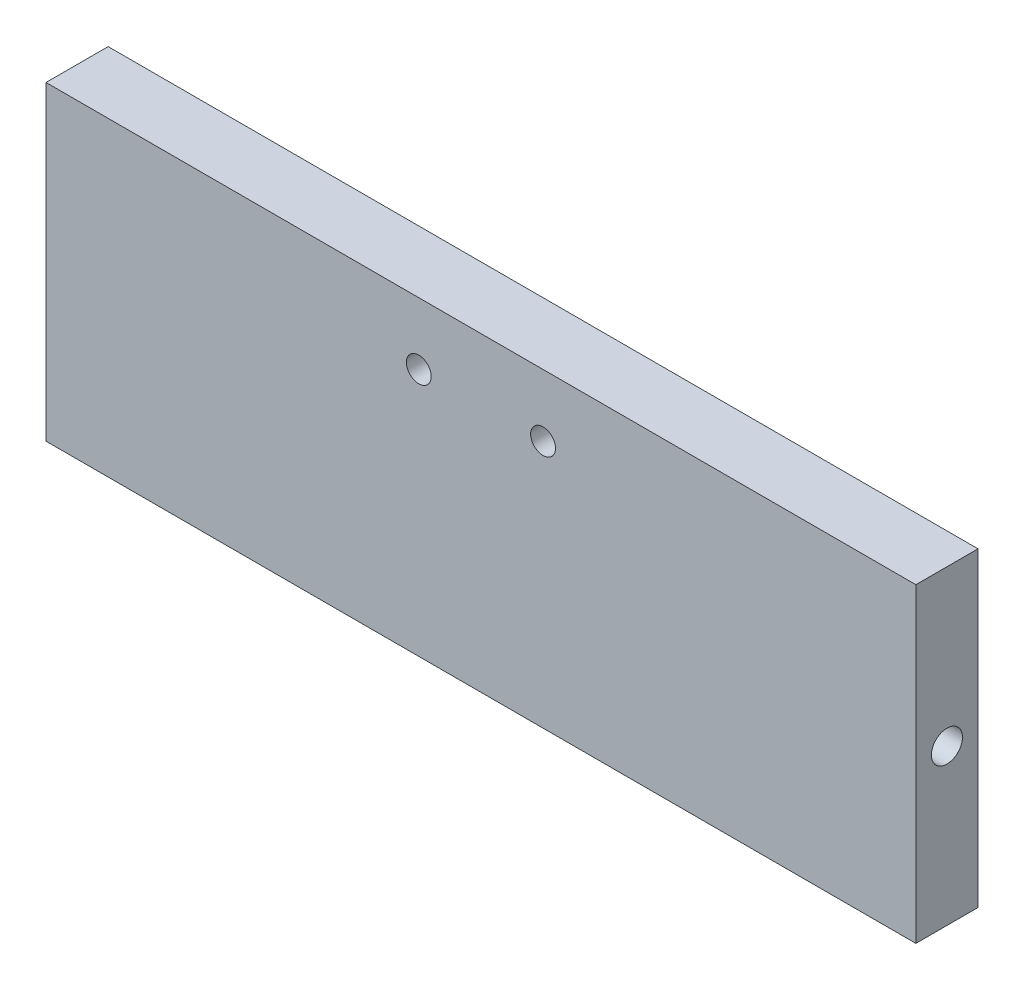
ISO-10303-21;
HEADER;
FILE_DESCRIPTION(('STEP AP214'),'2;1');
FILE_NAME('part.step','',(''),(''),'','','');
FILE_SCHEMA(('AUTOMOTIVE_DESIGN { 1 0 10303 214 1 1 1 1 }'));
ENDSEC;
DATA;
#1=APPLICATION_CONTEXT('core data for automotive mechanical design processes');
#2=APPLICATION_PROTOCOL_DEFINITION('international standard','automotive_design',2000,#1);
#3=PRODUCT_CONTEXT('',#1,'mechanical');
#4=PRODUCT('Part','Part','',(#3));
#5=PRODUCT_RELATED_PRODUCT_CATEGORY('part','',(#4));
#6=PRODUCT_DEFINITION_FORMATION('','',#4);
#7=PRODUCT_DEFINITION_CONTEXT('part definition',#1,'design');
#8=PRODUCT_DEFINITION('design','',#6,#7);
#9=PRODUCT_DEFINITION_SHAPE('','',#8);
#10=(LENGTH_UNIT() NAMED_UNIT(*) SI_UNIT(.MILLI.,.METRE.));
#11=(NAMED_UNIT(*) PLANE_ANGLE_UNIT() SI_UNIT($,.RADIAN.));
#12=(NAMED_UNIT(*) SI_UNIT($,.STERADIAN.) SOLID_ANGLE_UNIT());
#13=UNCERTAINTY_MEASURE_WITH_UNIT(LENGTH_MEASURE(1.E-05),#10,'distance_accuracy_value','');
#14=(GEOMETRIC_REPRESENTATION_CONTEXT(3) GLOBAL_UNCERTAINTY_ASSIGNED_CONTEXT((#13)) GLOBAL_UNIT_ASSIGNED_CONTEXT((#10,
#11,#12)) REPRESENTATION_CONTEXT('',''));
#15=CARTESIAN_POINT('',(0.,0.,0.));
#16=DIRECTION('',(0.,0.,1.));
#17=DIRECTION('',(1.,0.,0.));
#18=AXIS2_PLACEMENT_3D('',#15,#16,#17);
#19=CARTESIAN_POINT('',(0.,0.,10.));
#20=DIRECTION('',(0.,0.,-1.));
#21=DIRECTION('',(-1.,0.,0.));
#22=AXIS2_PLACEMENT_3D('',#19,#20,#21);
#23=PLANE('',#22);
#24=DIRECTION('',(0.,1.,0.));
#25=VECTOR('',#24,1.);
#26=CARTESIAN_POINT('',(70.,-25.,10.));
#27=LINE('',#26,#25);
#28=CARTESIAN_POINT('',(70.,-25.,10.));
#29=VERTEX_POINT('',#28);
#30=CARTESIAN_POINT('',(70.,25.,10.));
#31=VERTEX_POINT('',#30);
#32=EDGE_CURVE('E86',#29,#31,#27,.T.);
#33=ORIENTED_EDGE('',*,*,#32,.T.);
#34=DIRECTION('',(-1.,0.,0.));
#35=VECTOR('',#34,1.);
#36=CARTESIAN_POINT('',(-70.,25.,10.));
#37=LINE('',#36,#35);
#38=CARTESIAN_POINT('',(-70.,25.,10.));
#39=VERTEX_POINT('',#38);
#40=EDGE_CURVE('E81',#31,#39,#37,.T.);
#41=ORIENTED_EDGE('',*,*,#40,.T.);
#42=DIRECTION('',(0.,-1.,0.));
#43=VECTOR('',#42,1.);
#44=CARTESIAN_POINT('',(-70.,-25.,10.));
#45=LINE('',#44,#43);
#46=CARTESIAN_POINT('',(-70.,-25.,10.));
#47=VERTEX_POINT('',#46);
#48=EDGE_CURVE('E84',#39,#47,#45,.T.);
#49=ORIENTED_EDGE('',*,*,#48,.T.);
#50=DIRECTION('',(1.,0.,0.));
#51=VECTOR('',#50,1.);
#52=CARTESIAN_POINT('',(-70.,-25.,10.));
#53=LINE('',#52,#51);
#54=EDGE_CURVE('E51',#47,#29,#53,.T.);
#55=ORIENTED_EDGE('',*,*,#54,.T.);
#56=EDGE_LOOP('',(#33,#41,#49,#55));
#57=FACE_BOUND('',#56,.T.);
#58=CARTESIAN_POINT('',(-10.,15.,10.));
#59=DIRECTION('',(0.,0.,1.));
#60=DIRECTION('',(1.,0.,0.));
#61=AXIS2_PLACEMENT_3D('',#58,#59,#60);
#62=CIRCLE('',#61,2.);
#63=CARTESIAN_POINT('',(-8.,15.,10.));
#64=VERTEX_POINT('',#63);
#65=EDGE_CURVE('E102',#64,#64,#62,.T.);
#66=ORIENTED_EDGE('',*,*,#65,.F.);
#67=EDGE_LOOP('',(#66));
#68=FACE_BOUND('',#67,.T.);
#69=CARTESIAN_POINT('',(10.0000000000001,15.,10.));
#70=DIRECTION('',(0.,0.,1.));
#71=DIRECTION('',(-1.,0.,0.));
#72=AXIS2_PLACEMENT_3D('',#69,#70,#71);
#73=CIRCLE('',#72,2.);
#74=CARTESIAN_POINT('',(8.00000000000006,15.,10.));
#75=VERTEX_POINT('',#74);
#76=EDGE_CURVE('E117',#75,#75,#73,.T.);
#77=ORIENTED_EDGE('',*,*,#76,.F.);
#78=EDGE_LOOP('',(#77));
#79=FACE_BOUND('',#78,.T.);
#80=ADVANCED_FACE('F33',(#57,#68,#79),#23,.F.);
#81=CARTESIAN_POINT('',(0.,0.,0.));
#82=DIRECTION('',(0.,0.,-1.));
#83=DIRECTION('',(-1.,0.,0.));
#84=AXIS2_PLACEMENT_3D('',#81,#82,#83);
#85=PLANE('',#84);
#86=CARTESIAN_POINT('',(-10.,15.,0.));
#87=DIRECTION('',(0.,0.,1.));
#88=DIRECTION('',(1.,0.,0.));
#89=AXIS2_PLACEMENT_3D('',#86,#87,#88);
#90=CIRCLE('',#89,2.);
#91=CARTESIAN_POINT('',(-8.,15.,0.));
#92=VERTEX_POINT('',#91);
#93=EDGE_CURVE('E114',#92,#92,#90,.T.);
#94=ORIENTED_EDGE('',*,*,#93,.T.);
#95=EDGE_LOOP('',(#94));
#96=FACE_BOUND('',#95,.T.);
#97=DIRECTION('',(0.,1.,0.));
#98=VECTOR('',#97,1.);
#99=CARTESIAN_POINT('',(70.,-25.,0.));
#100=LINE('',#99,#98);
#101=CARTESIAN_POINT('',(70.,-25.,0.));
#102=VERTEX_POINT('',#101);
#103=CARTESIAN_POINT('',(70.,25.,0.));
#104=VERTEX_POINT('',#103);
#105=EDGE_CURVE('E99',#102,#104,#100,.T.);
#106=ORIENTED_EDGE('',*,*,#105,.F.);
#107=DIRECTION('',(1.,0.,0.));
#108=VECTOR('',#107,1.);
#109=CARTESIAN_POINT('',(-70.,-25.,0.));
#110=LINE('',#109,#108);
#111=CARTESIAN_POINT('',(-70.,-25.,0.));
#112=VERTEX_POINT('',#111);
#113=EDGE_CURVE('E74',#112,#102,#110,.T.);
#114=ORIENTED_EDGE('',*,*,#113,.F.);
#115=DIRECTION('',(0.,-1.,0.));
#116=VECTOR('',#115,1.);
#117=CARTESIAN_POINT('',(-70.,-25.,0.));
#118=LINE('',#117,#116);
#119=CARTESIAN_POINT('',(-70.,25.,0.));
#120=VERTEX_POINT('',#119);
#121=EDGE_CURVE('E68',#120,#112,#118,.T.);
#122=ORIENTED_EDGE('',*,*,#121,.F.);
#123=DIRECTION('',(-1.,0.,0.));
#124=VECTOR('',#123,1.);
#125=CARTESIAN_POINT('',(-70.,25.,0.));
#126=LINE('',#125,#124);
#127=EDGE_CURVE('E90',#104,#120,#126,.T.);
#128=ORIENTED_EDGE('',*,*,#127,.F.);
#129=EDGE_LOOP('',(#106,#114,#122,#128));
#130=FACE_BOUND('',#129,.T.);
#131=CARTESIAN_POINT('',(10.0000000000001,15.,0.));
#132=DIRECTION('',(0.,0.,1.));
#133=DIRECTION('',(-1.,0.,0.));
#134=AXIS2_PLACEMENT_3D('',#131,#132,#133);
#135=CIRCLE('',#134,2.);
#136=CARTESIAN_POINT('',(8.00000000000006,15.,0.));
#137=VERTEX_POINT('',#136);
#138=EDGE_CURVE('E120',#137,#137,#135,.T.);
#139=ORIENTED_EDGE('',*,*,#138,.T.);
#140=EDGE_LOOP('',(#139));
#141=FACE_BOUND('',#140,.T.);
#142=ADVANCED_FACE('F110',(#96,#130,#141),#85,.T.);
#143=CARTESIAN_POINT('',(70.,-25.,10.));
#144=DIRECTION('',(-1.,0.,0.));
#145=DIRECTION('',(0.,0.,1.));
#146=AXIS2_PLACEMENT_3D('',#143,#144,#145);
#147=PLANE('',#146);
#148=CARTESIAN_POINT('',(70.,0.,5.));
#149=DIRECTION('',(1.,0.,0.));
#150=DIRECTION('',(0.,0.,-1.));
#151=AXIS2_PLACEMENT_3D('',#148,#149,#150);
#152=CIRCLE('',#151,2.5);
#153=CARTESIAN_POINT('',(70.,0.,2.5));
#154=VERTEX_POINT('',#153);
#155=EDGE_CURVE('E125',#154,#154,#152,.T.);
#156=ORIENTED_EDGE('',*,*,#155,.F.);
#157=EDGE_LOOP('',(#156));
#158=FACE_BOUND('',#157,.T.);
#159=ORIENTED_EDGE('',*,*,#105,.T.);
#160=DIRECTION('',(0.,0.,-1.));
#161=VECTOR('',#160,1.);
#162=CARTESIAN_POINT('',(70.,25.,10.));
#163=LINE('',#162,#161);
#164=EDGE_CURVE('E11',#31,#104,#163,.T.);
#165=ORIENTED_EDGE('',*,*,#164,.F.);
#166=ORIENTED_EDGE('',*,*,#32,.F.);
#167=DIRECTION('',(0.,0.,-1.));
#168=VECTOR('',#167,1.);
#169=CARTESIAN_POINT('',(70.,-25.,10.));
#170=LINE('',#169,#168);
#171=EDGE_CURVE('E95',#29,#102,#170,.T.);
#172=ORIENTED_EDGE('',*,*,#171,.T.);
#173=EDGE_LOOP('',(#159,#165,#166,#172));
#174=FACE_BOUND('',#173,.T.);
#175=ADVANCED_FACE('F35',(#158,#174),#147,.F.);
#176=CARTESIAN_POINT('',(-70.,25.,10.));
#177=DIRECTION('',(0.,-1.,0.));
#178=DIRECTION('',(0.,0.,-1.));
#179=AXIS2_PLACEMENT_3D('',#176,#177,#178);
#180=PLANE('',#179);
#181=ORIENTED_EDGE('',*,*,#127,.T.);
#182=DIRECTION('',(0.,0.,-1.));
#183=VECTOR('',#182,1.);
#184=CARTESIAN_POINT('',(-70.,25.,10.));
#185=LINE('',#184,#183);
#186=EDGE_CURVE('E43',#39,#120,#185,.T.);
#187=ORIENTED_EDGE('',*,*,#186,.F.);
#188=ORIENTED_EDGE('',*,*,#40,.F.);
#189=ORIENTED_EDGE('',*,*,#164,.T.);
#190=EDGE_LOOP('',(#181,#187,#188,#189));
#191=FACE_BOUND('',#190,.T.);
#192=ADVANCED_FACE('F89',(#191),#180,.F.);
#193=CARTESIAN_POINT('',(-70.,-25.,10.));
#194=DIRECTION('',(1.,0.,0.));
#195=DIRECTION('',(0.,0.,-1.));
#196=AXIS2_PLACEMENT_3D('',#193,#194,#195);
#197=PLANE('',#196);
#198=CARTESIAN_POINT('',(-70.,0.,5.));
#199=DIRECTION('',(1.,0.,0.));
#200=DIRECTION('',(0.,0.,-1.));
#201=AXIS2_PLACEMENT_3D('',#198,#199,#200);
#202=CIRCLE('',#201,2.5);
#203=CARTESIAN_POINT('',(-70.,0.,2.5));
#204=VERTEX_POINT('',#203);
#205=EDGE_CURVE('E37',#204,#204,#202,.T.);
#206=ORIENTED_EDGE('',*,*,#205,.T.);
#207=EDGE_LOOP('',(#206));
#208=FACE_BOUND('',#207,.T.);
#209=ORIENTED_EDGE('',*,*,#121,.T.);
#210=DIRECTION('',(0.,0.,-1.));
#211=VECTOR('',#210,1.);
#212=CARTESIAN_POINT('',(-70.,-25.,10.));
#213=LINE('',#212,#211);
#214=EDGE_CURVE('E91',#47,#112,#213,.T.);
#215=ORIENTED_EDGE('',*,*,#214,.F.);
#216=ORIENTED_EDGE('',*,*,#48,.F.);
#217=ORIENTED_EDGE('',*,*,#186,.T.);
#218=EDGE_LOOP('',(#209,#215,#216,#217));
#219=FACE_BOUND('',#218,.T.);
#220=ADVANCED_FACE('F93',(#208,#219),#197,.F.);
#221=CARTESIAN_POINT('',(-70.,-25.,10.));
#222=DIRECTION('',(0.,1.,0.));
#223=DIRECTION('',(0.,0.,1.));
#224=AXIS2_PLACEMENT_3D('',#221,#222,#223);
#225=PLANE('',#224);
#226=ORIENTED_EDGE('',*,*,#113,.T.);
#227=ORIENTED_EDGE('',*,*,#171,.F.);
#228=ORIENTED_EDGE('',*,*,#54,.F.);
#229=ORIENTED_EDGE('',*,*,#214,.T.);
#230=EDGE_LOOP('',(#226,#227,#228,#229));
#231=FACE_BOUND('',#230,.T.);
#232=ADVANCED_FACE('F107',(#231),#225,.F.);
#233=CARTESIAN_POINT('',(-10.,15.,10.));
#234=DIRECTION('',(0.,0.,-1.));
#235=DIRECTION('',(-1.,0.,0.));
#236=AXIS2_PLACEMENT_3D('',#233,#234,#235);
#237=CYLINDRICAL_SURFACE('',#236,2.);
#238=ORIENTED_EDGE('',*,*,#65,.T.);
#239=EDGE_LOOP('',(#238));
#240=FACE_BOUND('',#239,.T.);
#241=ORIENTED_EDGE('',*,*,#93,.F.);
#242=EDGE_LOOP('',(#241));
#243=FACE_BOUND('',#242,.T.);
#244=ADVANCED_FACE('F140',(#240,#243),#237,.F.);
#245=CARTESIAN_POINT('',(10.0000000000001,15.,10.));
#246=DIRECTION('',(0.,0.,-1.));
#247=DIRECTION('',(-1.,0.,0.));
#248=AXIS2_PLACEMENT_3D('',#245,#246,#247);
#249=CYLINDRICAL_SURFACE('',#248,2.);
#250=ORIENTED_EDGE('',*,*,#76,.T.);
#251=EDGE_LOOP('',(#250));
#252=FACE_BOUND('',#251,.T.);
#253=ORIENTED_EDGE('',*,*,#138,.F.);
#254=EDGE_LOOP('',(#253));
#255=FACE_BOUND('',#254,.T.);
#256=ADVANCED_FACE('F135',(#252,#255),#249,.F.);
#257=CARTESIAN_POINT('',(-83.0000000000001,0.,5.));
#258=DIRECTION('',(1.,0.,0.));
#259=DIRECTION('',(0.,0.,-1.));
#260=AXIS2_PLACEMENT_3D('',#257,#258,#259);
#261=CYLINDRICAL_SURFACE('',#260,2.5);
#262=ORIENTED_EDGE('',*,*,#155,.T.);
#263=EDGE_LOOP('',(#262));
#264=FACE_BOUND('',#263,.T.);
#265=ORIENTED_EDGE('',*,*,#205,.F.);
#266=EDGE_LOOP('',(#265));
#267=FACE_BOUND('',#266,.T.);
#268=ADVANCED_FACE('F133',(#264,#267),#261,.F.);
#269=CLOSED_SHELL('',(#80,#142,#175,#192,#220,#232,#244,#256,#268));
#270=MANIFOLD_SOLID_BREP('B2',#269);
#271=ADVANCED_BREP_SHAPE_REPRESENTATION('',(#18,#270),#14);
#272=SHAPE_DEFINITION_REPRESENTATION(#9,#271);
ENDSEC;
END-ISO-10303-21;
